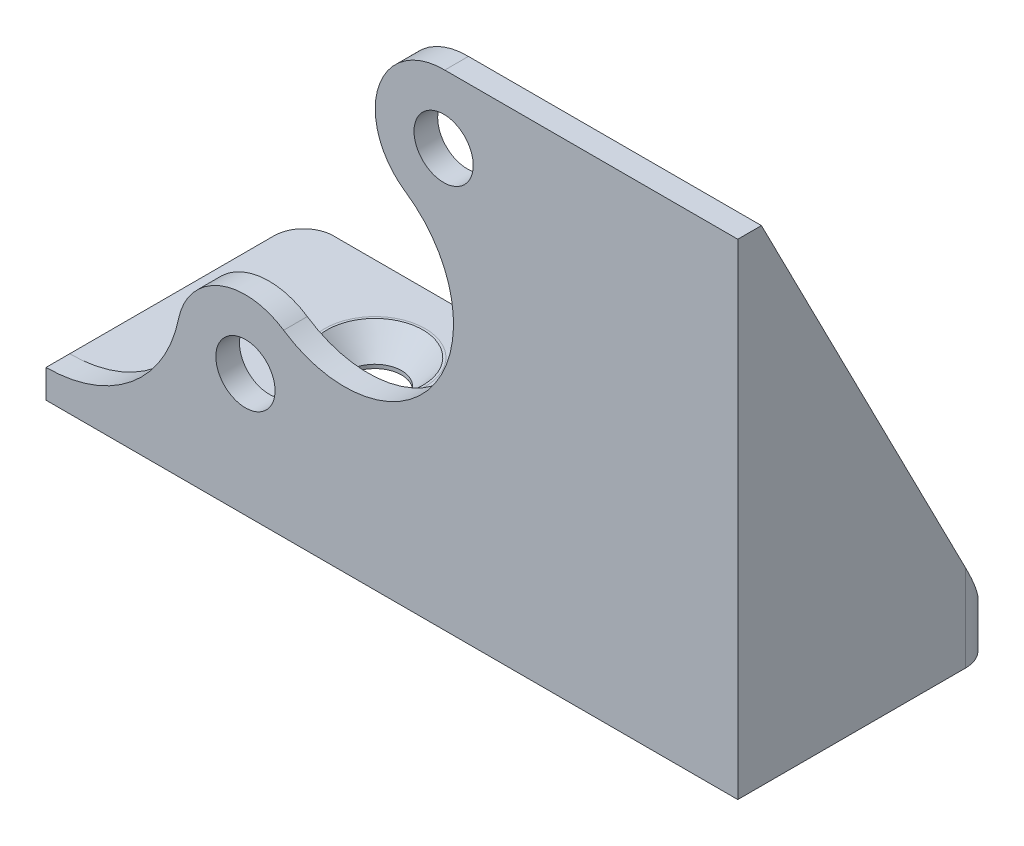
ISO-10303-21;
HEADER;
FILE_DESCRIPTION(('STEP AP214'),'2;1');
FILE_NAME('part.step','',(''),(''),'','','');
FILE_SCHEMA(('AUTOMOTIVE_DESIGN { 1 0 10303 214 1 1 1 1 }'));
ENDSEC;
DATA;
#1=APPLICATION_CONTEXT('core data for automotive mechanical design processes');
#2=APPLICATION_PROTOCOL_DEFINITION('international standard','automotive_design',2000,#1);
#3=PRODUCT_CONTEXT('',#1,'mechanical');
#4=PRODUCT('Part','Part','',(#3));
#5=PRODUCT_RELATED_PRODUCT_CATEGORY('part','',(#4));
#6=PRODUCT_DEFINITION_FORMATION('','',#4);
#7=PRODUCT_DEFINITION_CONTEXT('part definition',#1,'design');
#8=PRODUCT_DEFINITION('design','',#6,#7);
#9=PRODUCT_DEFINITION_SHAPE('','',#8);
#10=(LENGTH_UNIT() NAMED_UNIT(*) SI_UNIT(.MILLI.,.METRE.));
#11=(NAMED_UNIT(*) PLANE_ANGLE_UNIT() SI_UNIT($,.RADIAN.));
#12=(NAMED_UNIT(*) SI_UNIT($,.STERADIAN.) SOLID_ANGLE_UNIT());
#13=UNCERTAINTY_MEASURE_WITH_UNIT(LENGTH_MEASURE(1.E-05),#10,'distance_accuracy_value','');
#14=(GEOMETRIC_REPRESENTATION_CONTEXT(3) GLOBAL_UNCERTAINTY_ASSIGNED_CONTEXT((#13)) GLOBAL_UNIT_ASSIGNED_CONTEXT((#10,
#11,#12)) REPRESENTATION_CONTEXT('',''));
#15=CARTESIAN_POINT('',(0.,0.,0.));
#16=DIRECTION('',(0.,0.,1.));
#17=DIRECTION('',(1.,0.,0.));
#18=AXIS2_PLACEMENT_3D('',#15,#16,#17);
#19=CARTESIAN_POINT('',(85.20684,10.16,0.));
#20=DIRECTION('',(0.,0.,1.));
#21=DIRECTION('',(0.,-1.,0.));
#22=AXIS2_PLACEMENT_3D('',#19,#20,#21);
#23=CYLINDRICAL_SURFACE('',#22,6.35);
#24=CARTESIAN_POINT('',(85.20684,3.81,-17.7226847710446));
#25=CARTESIAN_POINT('',(85.354379722513,3.80998373406652,-17.8121221627858));
#26=CARTESIAN_POINT('',(85.498198826381,3.8151402255102,-17.9074838363655));
#27=CARTESIAN_POINT('',(85.7772022005539,3.83412826148672,-18.1089939360989));
#28=CARTESIAN_POINT('',(85.9123972850762,3.84794869637912,-18.21512840262));
#29=CARTESIAN_POINT('',(86.1726238699845,3.88250726730236,-18.4367445525352));
#30=CARTESIAN_POINT('',(86.297707202864,3.90320691962987,-18.5521715884824));
#31=CARTESIAN_POINT('',(86.5378782720371,3.94986186683063,-18.7919935550968));
#32=CARTESIAN_POINT('',(86.6529627990034,3.9758188403117,-18.9163913418415));
#33=CARTESIAN_POINT('',(86.9814337794092,4.0588438523635,-19.3007529360063));
#34=CARTESIAN_POINT('',(87.1794215779039,4.12128343337041,-19.5730704513461));
#35=CARTESIAN_POINT('',(87.4427374000977,4.21592543319725,-20.0017820946959));
#36=CARTESIAN_POINT('',(87.5249885153752,4.24768104527225,-20.1482747514422));
#37=CARTESIAN_POINT('',(87.6779262315634,4.30995394851132,-20.4475145014094));
#38=CARTESIAN_POINT('',(87.7486117411309,4.34047112261098,-20.6002621831629));
#39=CARTESIAN_POINT('',(87.8839943838683,4.40140917666914,-20.9257897625941));
#40=CARTESIAN_POINT('',(87.9475191764759,4.43155593230939,-21.0991097573252));
#41=CARTESIAN_POINT('',(88.059617716431,4.48654773426665,-21.4512718790294));
#42=CARTESIAN_POINT('',(88.1081981332002,4.51139514406898,-21.6301115033606));
#43=CARTESIAN_POINT('',(88.1898174987243,4.55406825279581,-21.9918554761606));
#44=CARTESIAN_POINT('',(88.2228798887303,4.57190453593454,-22.1747532538717));
#45=CARTESIAN_POINT('',(88.2730950235013,4.59929783272596,-22.5433279708794));
#46=CARTESIAN_POINT('',(88.2902501906425,4.60885610695186,-22.7290044826488));
#47=CARTESIAN_POINT('',(88.3075518030532,4.61850499387268,-23.0843542628922));
#48=CARTESIAN_POINT('',(88.3091096800331,4.61938118381739,-23.2539389021093));
#49=CARTESIAN_POINT('',(88.2988519097806,4.61365008727892,-23.5925680064854));
#50=CARTESIAN_POINT('',(88.2870369021661,4.60704315870927,-23.7616124970916));
#51=CARTESIAN_POINT('',(88.2501848431399,4.58676088340801,-24.0978899891909));
#52=CARTESIAN_POINT('',(88.2251425403864,4.5730827293893,-24.2651222442831));
#53=CARTESIAN_POINT('',(88.1621592443436,4.53951602063235,-24.5964636815241));
#54=CARTESIAN_POINT('',(88.1242179604866,4.51962732599381,-24.7605727932319));
#55=CARTESIAN_POINT('',(87.9958603807992,4.45448655398265,-25.2311211178603));
#56=CARTESIAN_POINT('',(87.8889952077121,4.40254770628755,-25.5322837829604));
#57=CARTESIAN_POINT('',(87.6326709862505,4.28996431406812,-26.1144370367338));
#58=CARTESIAN_POINT('',(87.4831593136597,4.22930905998869,-26.3954021627393));
#59=CARTESIAN_POINT('',(87.2177872075547,4.13596863207643,-26.8160491532045));
#60=CARTESIAN_POINT('',(87.1153979798537,4.10254727148534,-26.9642177261155));
#61=CARTESIAN_POINT('',(86.898206354131,4.03834993775841,-27.251888261672));
#62=CARTESIAN_POINT('',(86.7834009668502,4.0075746048839,-27.3913881244919));
#63=CARTESIAN_POINT('',(86.5422654225588,3.95077763399164,-27.6604019669838));
#64=CARTESIAN_POINT('',(86.4159670852707,3.92474343600862,-27.7899417896237));
#65=CARTESIAN_POINT('',(86.1523218270195,3.87936025336879,-28.0384012367875));
#66=CARTESIAN_POINT('',(86.0149826649179,3.86000662375526,-28.1573281975342));
#67=CARTESIAN_POINT('',(85.7668678227715,3.8338508775464,-28.3543840015657));
#68=CARTESIAN_POINT('',(85.6583674928954,3.82509948733602,-28.4351285890268));
#69=CARTESIAN_POINT('',(85.4362838435122,3.81317042384981,-28.5897708085495));
#70=CARTESIAN_POINT('',(85.3226998159572,3.80999352947218,-28.6636674824181));
#71=CARTESIAN_POINT('',(85.20684,3.81,-28.7339153649557));
#72=B_SPLINE_CURVE_WITH_KNOTS('',3,(#24,#25,#26,#27,#28,#29,#30,#31,#32,#33,#34,#35,#36,#37,#38,
#39,#40,#41,#42,#43,#44,#45,#46,#47,#48,#49,#50,#51,#52,#53,#54,#55,#56,#57,#58,#59,#60,#61,#62,
#63,#64,#65,#66,#67,#68,#69,#70,#71),.UNSPECIFIED.,.F.,.F.,(4,2,2,2,2,2,2,2,2,2,2,2,2,2,2,2,2,2,
2,2,2,2,2,4),(0.,0.517213777482924,1.03376569253408,1.54747523650469,2.06134906187964,
3.08365328336137,3.59622214200442,4.10883933934088,4.66923868044842,5.22938756078055,
5.7886875452052,6.34790234457907,6.8559989407938,7.36407123604878,7.87234539183976,
8.38063099797549,9.34784763169406,10.3162629771403,10.8652494101558,11.4143683101634,
11.9620106524703,12.5092714519166,12.915501123055,13.3217875502457),.UNSPECIFIED.);
#73=CARTESIAN_POINT('',(85.20684,3.81,-17.7226847710446));
#74=VERTEX_POINT('',#73);
#75=CARTESIAN_POINT('',(85.20684,3.81,-28.7339153649557));
#76=VERTEX_POINT('',#75);
#77=EDGE_CURVE('E245',#74,#76,#72,.T.);
#78=ORIENTED_EDGE('',*,*,#77,.F.);
#79=DIRECTION('',(0.,0.,1.));
#80=VECTOR('',#79,1.);
#81=CARTESIAN_POINT('',(85.20684,3.81,-3.175));
#82=LINE('',#81,#80);
#83=CARTESIAN_POINT('',(85.20684,3.81000000000001,-17.3691315025746));
#84=VERTEX_POINT('',#83);
#85=EDGE_CURVE('E254',#84,#74,#82,.F.);
#86=ORIENTED_EDGE('',*,*,#85,.F.);
#87=CARTESIAN_POINT('',(85.20684,3.81,-3.175));
#88=VERTEX_POINT('',#87);
#89=EDGE_CURVE('E265',#88,#84,#82,.F.);
#90=ORIENTED_EDGE('',*,*,#89,.F.);
#91=CARTESIAN_POINT('',(85.20684,10.16,-3.175));
#92=DIRECTION('',(0.,0.,1.));
#93=DIRECTION('',(1.,0.,0.));
#94=AXIS2_PLACEMENT_3D('',#91,#92,#93);
#95=CIRCLE('',#94,6.35);
#96=CARTESIAN_POINT('',(91.55684,10.16,-3.17499999999999));
#97=VERTEX_POINT('',#96);
#98=EDGE_CURVE('E275',#97,#88,#95,.F.);
#99=ORIENTED_EDGE('',*,*,#98,.F.);
#100=DIRECTION('',(0.,0.,1.));
#101=VECTOR('',#100,1.);
#102=CARTESIAN_POINT('',(91.55684,10.16,0.));
#103=LINE('',#102,#101);
#104=CARTESIAN_POINT('',(91.55684,10.16,-31.3423161271238));
#105=VERTEX_POINT('',#104);
#106=EDGE_CURVE('E280',#105,#97,#103,.T.);
#107=ORIENTED_EDGE('',*,*,#106,.F.);
#108=CARTESIAN_POINT('',(85.20684,10.16,-31.3423161271238));
#109=DIRECTION('',(0.,0.455880849534502,-0.890040814248257));
#110=DIRECTION('',(0.,0.890040814248257,0.455880849534502));
#111=AXIS2_PLACEMENT_3D('',#108,#109,#110);
#112=ELLIPSE('',#111,7.13450428154052,6.35);
#113=CARTESIAN_POINT('',(85.20684,3.81,-34.5948));
#114=VERTEX_POINT('',#113);
#115=EDGE_CURVE('E271',#114,#105,#112,.F.);
#116=ORIENTED_EDGE('',*,*,#115,.F.);
#117=CARTESIAN_POINT('',(85.20684,3.81000000000001,-29.0874686334257));
#118=VERTEX_POINT('',#117);
#119=EDGE_CURVE('E267',#118,#114,#82,.F.);
#120=ORIENTED_EDGE('',*,*,#119,.F.);
#121=EDGE_CURVE('E143',#76,#118,#82,.F.);
#122=ORIENTED_EDGE('',*,*,#121,.F.);
#123=EDGE_LOOP('',(#78,#86,#90,#99,#107,#116,#120,#122));
#124=FACE_BOUND('',#123,.T.);
#125=ADVANCED_FACE('F128',(#124),#23,.F.);
#126=CARTESIAN_POINT('',(130.055584981414,3.81,-3.175));
#127=DIRECTION('',(0.,-1.,0.));
#128=DIRECTION('',(0.,0.,1.));
#129=AXIS2_PLACEMENT_3D('',#126,#127,#128);
#130=PLANE('',#129);
#131=CARTESIAN_POINT('',(25.9680328160001,3.81000000000001,-23.2283000680002));
#132=DIRECTION('',(0.,-1.,0.));
#133=DIRECTION('',(0.,0.,-1.));
#134=AXIS2_PLACEMENT_3D('',#131,#132,#133);
#135=CIRCLE('',#134,6.7437);
#136=CARTESIAN_POINT('',(25.9680328160001,3.81000000000001,-29.9720000680002));
#137=VERTEX_POINT('',#136);
#138=EDGE_CURVE('E137',#137,#137,#135,.F.);
#139=ORIENTED_EDGE('',*,*,#138,.F.);
#140=EDGE_LOOP('',(#139));
#141=FACE_BOUND('',#140,.T.);
#142=CARTESIAN_POINT('',(81.8680328160001,3.81000000000001,-23.2283000680001));
#143=DIRECTION('',(0.,-1.,0.));
#144=DIRECTION('',(0.,0.,-1.));
#145=AXIS2_PLACEMENT_3D('',#142,#143,#144);
#146=CIRCLE('',#145,6.74370000000001);
#147=EDGE_CURVE('E12',#118,#84,#146,.F.);
#148=ORIENTED_EDGE('',*,*,#147,.F.);
#149=ORIENTED_EDGE('',*,*,#119,.T.);
#150=DIRECTION('',(-1.,0.,0.));
#151=VECTOR('',#150,1.);
#152=CARTESIAN_POINT('',(130.055584981414,3.81,-34.5948));
#153=LINE('',#152,#151);
#154=CARTESIAN_POINT('',(9.03477999999999,3.81,-34.5948));
#155=VERTEX_POINT('',#154);
#156=EDGE_CURVE('E383',#114,#155,#153,.T.);
#157=ORIENTED_EDGE('',*,*,#156,.T.);
#158=CARTESIAN_POINT('',(9.03478,3.81,-30.5943));
#159=DIRECTION('',(0.,1.,0.));
#160=DIRECTION('',(0.,0.,1.));
#161=AXIS2_PLACEMENT_3D('',#158,#159,#160);
#162=CIRCLE('',#161,4.0005);
#163=CARTESIAN_POINT('',(5.03428,3.81,-30.5943));
#164=VERTEX_POINT('',#163);
#165=EDGE_CURVE('E332',#164,#155,#162,.F.);
#166=ORIENTED_EDGE('',*,*,#165,.F.);
#167=DIRECTION('',(0.,0.,-1.));
#168=VECTOR('',#167,1.);
#169=CARTESIAN_POINT('',(5.03428,3.81,-3.175));
#170=LINE('',#169,#168);
#171=CARTESIAN_POINT('',(5.03428,3.81,-3.175));
#172=VERTEX_POINT('',#171);
#173=EDGE_CURVE('E384',#172,#164,#170,.T.);
#174=ORIENTED_EDGE('',*,*,#173,.F.);
#175=DIRECTION('',(-1.,0.,0.));
#176=VECTOR('',#175,1.);
#177=CARTESIAN_POINT('',(130.055584981414,3.81,-3.175));
#178=LINE('',#177,#176);
#179=EDGE_CURVE('E374',#88,#172,#178,.T.);
#180=ORIENTED_EDGE('',*,*,#179,.F.);
#181=ORIENTED_EDGE('',*,*,#89,.T.);
#182=EDGE_LOOP('',(#148,#149,#157,#166,#174,#180,#181));
#183=FACE_BOUND('',#182,.T.);
#184=ADVANCED_FACE('F502',(#141,#183),#130,.F.);
#185=ORIENTED_EDGE('',*,*,#85,.T.);
#186=CARTESIAN_POINT('',(81.8680328160001,3.81,-23.2283000680001));
#187=DIRECTION('',(0.,1.,0.));
#188=DIRECTION('',(0.,0.,1.));
#189=AXIS2_PLACEMENT_3D('',#186,#187,#188);
#190=CIRCLE('',#189,6.4389);
#191=EDGE_CURVE('E250',#76,#74,#190,.T.);
#192=ORIENTED_EDGE('',*,*,#191,.F.);
#193=ORIENTED_EDGE('',*,*,#121,.T.);
#194=ORIENTED_EDGE('',*,*,#147,.T.);
#195=EDGE_LOOP('',(#185,#192,#193,#194));
#196=FACE_BOUND('',#195,.T.);
#197=ADVANCED_FACE('F263',(#196),#130,.F.);
#198=CARTESIAN_POINT('',(97.90684,0.,3.175));
#199=DIRECTION('',(-1.,0.,0.));
#200=DIRECTION('',(0.,0.,1.));
#201=AXIS2_PLACEMENT_3D('',#198,#199,#200);
#202=PLANE('',#201);
#203=DIRECTION('',(0.,0.,-1.));
#204=VECTOR('',#203,1.);
#205=CARTESIAN_POINT('',(97.90684,65.1525731834804,3.175));
#206=LINE('',#205,#204);
#207=CARTESIAN_POINT('',(97.90684,65.1525731834804,0.));
#208=VERTEX_POINT('',#207);
#209=CARTESIAN_POINT('',(97.90684,65.1525731834804,-3.175));
#210=VERTEX_POINT('',#209);
#211=EDGE_CURVE('E300',#208,#210,#206,.T.);
#212=ORIENTED_EDGE('',*,*,#211,.F.);
#213=DIRECTION('',(0.,-1.,0.));
#214=VECTOR('',#213,1.);
#215=CARTESIAN_POINT('',(97.90684,0.,0.));
#216=LINE('',#215,#214);
#217=CARTESIAN_POINT('',(97.90684,0.,0.));
#218=VERTEX_POINT('',#217);
#219=EDGE_CURVE('E413',#208,#218,#216,.T.);
#220=ORIENTED_EDGE('',*,*,#219,.T.);
#221=DIRECTION('',(0.,0.,-1.));
#222=VECTOR('',#221,1.);
#223=CARTESIAN_POINT('',(97.90684,0.,-3.175));
#224=LINE('',#223,#222);
#225=CARTESIAN_POINT('',(97.90684,0.,-30.5943));
#226=VERTEX_POINT('',#225);
#227=EDGE_CURVE('E317',#218,#226,#224,.T.);
#228=ORIENTED_EDGE('',*,*,#227,.T.);
#229=DIRECTION('',(0.,1.,0.));
#230=VECTOR('',#229,1.);
#231=CARTESIAN_POINT('',(97.90684,0.,-30.5943));
#232=LINE('',#231,#230);
#233=CARTESIAN_POINT('',(97.90684,11.6203923010494,-30.5943));
#234=VERTEX_POINT('',#233);
#235=EDGE_CURVE('E325',#234,#226,#232,.F.);
#236=ORIENTED_EDGE('',*,*,#235,.F.);
#237=DIRECTION('',(0.,-0.890040814248257,-0.455880849534502));
#238=VECTOR('',#237,1.);
#239=CARTESIAN_POINT('',(97.90684,3.81,-34.5948));
#240=LINE('',#239,#238);
#241=EDGE_CURVE('E389',#210,#234,#240,.T.);
#242=ORIENTED_EDGE('',*,*,#241,.F.);
#243=EDGE_LOOP('',(#212,#220,#228,#236,#242));
#244=FACE_BOUND('',#243,.T.);
#245=ADVANCED_FACE('F538',(#244),#202,.F.);
#246=CARTESIAN_POINT('',(0.,0.,3.175));
#247=DIRECTION('',(0.,1.,0.));
#248=DIRECTION('',(0.,0.,1.));
#249=AXIS2_PLACEMENT_3D('',#246,#247,#248);
#250=PLANE('',#249);
#251=CARTESIAN_POINT('',(25.9680328160001,0.,-23.2283000680002));
#252=DIRECTION('',(0.,1.,0.));
#253=DIRECTION('',(0.,0.,1.));
#254=AXIS2_PLACEMENT_3D('',#251,#252,#253);
#255=CIRCLE('',#254,3.57124);
#256=CARTESIAN_POINT('',(25.9680328160001,0.,-19.6570600680002));
#257=VERTEX_POINT('',#256);
#258=EDGE_CURVE('E262',#257,#257,#255,.T.);
#259=ORIENTED_EDGE('',*,*,#258,.T.);
#260=EDGE_LOOP('',(#259));
#261=FACE_BOUND('',#260,.T.);
#262=CARTESIAN_POINT('',(81.8680328160001,0.,-23.2283000680001));
#263=DIRECTION('',(0.,1.,0.));
#264=DIRECTION('',(0.,0.,1.));
#265=AXIS2_PLACEMENT_3D('',#262,#263,#264);
#266=CIRCLE('',#265,3.57124);
#267=CARTESIAN_POINT('',(81.8680328160001,0.,-19.6570600680001));
#268=VERTEX_POINT('',#267);
#269=EDGE_CURVE('E439',#268,#268,#266,.T.);
#270=ORIENTED_EDGE('',*,*,#269,.T.);
#271=EDGE_LOOP('',(#270));
#272=FACE_BOUND('',#271,.T.);
#273=DIRECTION('',(-1.,0.,0.));
#274=VECTOR('',#273,1.);
#275=CARTESIAN_POINT('',(0.,0.,0.));
#276=LINE('',#275,#274);
#277=CARTESIAN_POINT('',(5.03428,0.,0.));
#278=VERTEX_POINT('',#277);
#279=EDGE_CURVE('E417',#218,#278,#276,.T.);
#280=ORIENTED_EDGE('',*,*,#279,.T.);
#281=DIRECTION('',(0.,0.,1.));
#282=VECTOR('',#281,1.);
#283=CARTESIAN_POINT('',(5.03428,0.,-3.175));
#284=LINE('',#283,#282);
#285=CARTESIAN_POINT('',(5.03428,0.,-30.5943));
#286=VERTEX_POINT('',#285);
#287=EDGE_CURVE('E301',#286,#278,#284,.T.);
#288=ORIENTED_EDGE('',*,*,#287,.F.);
#289=CARTESIAN_POINT('',(9.03478000000001,0.,-30.5943));
#290=DIRECTION('',(0.,1.,0.));
#291=DIRECTION('',(0.,0.,1.));
#292=AXIS2_PLACEMENT_3D('',#289,#290,#291);
#293=CIRCLE('',#292,4.0005);
#294=CARTESIAN_POINT('',(9.03478000000001,0.,-34.5948));
#295=VERTEX_POINT('',#294);
#296=EDGE_CURVE('E295',#286,#295,#293,.F.);
#297=ORIENTED_EDGE('',*,*,#296,.T.);
#298=DIRECTION('',(1.,0.,0.));
#299=VECTOR('',#298,1.);
#300=CARTESIAN_POINT('',(9.03478000000001,0.,-34.5948));
#301=LINE('',#300,#299);
#302=CARTESIAN_POINT('',(93.90634,0.,-34.5948));
#303=VERTEX_POINT('',#302);
#304=EDGE_CURVE('E434',#295,#303,#301,.T.);
#305=ORIENTED_EDGE('',*,*,#304,.T.);
#306=CARTESIAN_POINT('',(93.90634,0.,-30.5943));
#307=DIRECTION('',(0.,1.,0.));
#308=DIRECTION('',(0.,0.,1.));
#309=AXIS2_PLACEMENT_3D('',#306,#307,#308);
#310=CIRCLE('',#309,4.0005);
#311=EDGE_CURVE('E431',#303,#226,#310,.F.);
#312=ORIENTED_EDGE('',*,*,#311,.T.);
#313=ORIENTED_EDGE('',*,*,#227,.F.);
#314=EDGE_LOOP('',(#280,#288,#297,#305,#312,#313));
#315=FACE_BOUND('',#314,.T.);
#316=ADVANCED_FACE('F541',(#261,#272,#315),#250,.F.);
#317=CARTESIAN_POINT('',(5.03427999999997,21.9626785235299,3.175));
#318=DIRECTION('',(0.,0.,-1.));
#319=DIRECTION('',(-1.,0.,0.));
#320=AXIS2_PLACEMENT_3D('',#317,#318,#319);
#321=CYLINDRICAL_SURFACE('',#320,18.1526785235299);
#322=CARTESIAN_POINT('',(5.03427999999997,21.9626785235299,0.));
#323=DIRECTION('',(0.,0.,-1.));
#324=DIRECTION('',(-1.,0.,0.));
#325=AXIS2_PLACEMENT_3D('',#322,#323,#324);
#326=CIRCLE('',#325,18.1526785235299);
#327=CARTESIAN_POINT('',(22.8171620588056,18.3172919512674,0.));
#328=VERTEX_POINT('',#327);
#329=CARTESIAN_POINT('',(5.03428,3.81000000000001,0.));
#330=VERTEX_POINT('',#329);
#331=EDGE_CURVE('E421',#328,#330,#326,.T.);
#332=ORIENTED_EDGE('',*,*,#331,.F.);
#333=DIRECTION('',(0.,0.,-1.));
#334=VECTOR('',#333,1.);
#335=CARTESIAN_POINT('',(22.8171620588057,18.3172919512674,3.175));
#336=LINE('',#335,#334);
#337=CARTESIAN_POINT('',(22.8171620588057,18.3172919512674,-3.175));
#338=VERTEX_POINT('',#337);
#339=EDGE_CURVE('E287',#328,#338,#336,.T.);
#340=ORIENTED_EDGE('',*,*,#339,.T.);
#341=CARTESIAN_POINT('',(5.03427999999997,21.9626785235299,-3.175));
#342=DIRECTION('',(0.,0.,-1.));
#343=DIRECTION('',(-1.,0.,0.));
#344=AXIS2_PLACEMENT_3D('',#341,#342,#343);
#345=CIRCLE('',#344,18.1526785235299);
#346=EDGE_CURVE('E365',#172,#338,#345,.F.);
#347=ORIENTED_EDGE('',*,*,#346,.F.);
#348=DIRECTION('',(0.,0.,-1.));
#349=VECTOR('',#348,1.);
#350=CARTESIAN_POINT('',(5.03428,3.81000000000001,3.175));
#351=LINE('',#350,#349);
#352=EDGE_CURVE('E296',#330,#172,#351,.T.);
#353=ORIENTED_EDGE('',*,*,#352,.F.);
#354=EDGE_LOOP('',(#332,#340,#347,#353));
#355=FACE_BOUND('',#354,.T.);
#356=ADVANCED_FACE('F525',(#355),#321,.F.);
#357=CARTESIAN_POINT('',(31.8101655818956,16.4737789493269,3.175));
#358=DIRECTION('',(0.,0.,-1.));
#359=DIRECTION('',(-1.,0.,0.));
#360=AXIS2_PLACEMENT_3D('',#357,#358,#359);
#361=CYLINDRICAL_SURFACE('',#360,9.18001375568854);
#362=CARTESIAN_POINT('',(31.8101655818956,16.4737789493269,0.));
#363=DIRECTION('',(0.,0.,-1.));
#364=DIRECTION('',(-1.,0.,0.));
#365=AXIS2_PLACEMENT_3D('',#362,#363,#364);
#366=CIRCLE('',#365,9.18001375568854);
#367=CARTESIAN_POINT('',(36.9386526799485,24.087665777993,0.));
#368=VERTEX_POINT('',#367);
#369=EDGE_CURVE('E394',#368,#328,#366,.F.);
#370=ORIENTED_EDGE('',*,*,#369,.F.);
#371=DIRECTION('',(0.,0.,-1.));
#372=VECTOR('',#371,1.);
#373=CARTESIAN_POINT('',(36.9386526799485,24.087665777993,3.175));
#374=LINE('',#373,#372);
#375=CARTESIAN_POINT('',(36.9386526799485,24.087665777993,-3.175));
#376=VERTEX_POINT('',#375);
#377=EDGE_CURVE('E310',#368,#376,#374,.T.);
#378=ORIENTED_EDGE('',*,*,#377,.T.);
#379=CARTESIAN_POINT('',(31.8101655818956,16.4737789493269,-3.175));
#380=DIRECTION('',(0.,0.,-1.));
#381=DIRECTION('',(-1.,0.,0.));
#382=AXIS2_PLACEMENT_3D('',#379,#380,#381);
#383=CIRCLE('',#382,9.18001375568854);
#384=EDGE_CURVE('E348',#338,#376,#383,.T.);
#385=ORIENTED_EDGE('',*,*,#384,.F.);
#386=ORIENTED_EDGE('',*,*,#339,.F.);
#387=EDGE_LOOP('',(#370,#378,#385,#386));
#388=FACE_BOUND('',#387,.T.);
#389=ADVANCED_FACE('F521',(#388),#361,.T.);
#390=CARTESIAN_POINT('',(45.1132065437581,36.2238234408466,3.175));
#391=DIRECTION('',(0.,0.,-1.));
#392=DIRECTION('',(-1.,0.,0.));
#393=AXIS2_PLACEMENT_3D('',#390,#391,#392);
#394=CYLINDRICAL_SURFACE('',#393,14.6324862443115);
#395=ORIENTED_EDGE('',*,*,#377,.F.);
#396=CARTESIAN_POINT('',(45.1132065437581,36.2238234408466,0.));
#397=DIRECTION('',(0.,0.,-1.));
#398=DIRECTION('',(-1.,0.,0.));
#399=AXIS2_PLACEMENT_3D('',#396,#397,#398);
#400=CIRCLE('',#399,14.6324862443115);
#401=CARTESIAN_POINT('',(53.287760407567,48.3599811037007,0.));
#402=VERTEX_POINT('',#401);
#403=EDGE_CURVE('E402',#368,#402,#400,.F.);
#404=ORIENTED_EDGE('',*,*,#403,.T.);
#405=DIRECTION('',(0.,0.,-1.));
#406=VECTOR('',#405,1.);
#407=CARTESIAN_POINT('',(53.287760407567,48.3599811037007,3.175));
#408=LINE('',#407,#406);
#409=CARTESIAN_POINT('',(53.287760407567,48.3599811037007,-3.175));
#410=VERTEX_POINT('',#409);
#411=EDGE_CURVE('E307',#402,#410,#408,.T.);
#412=ORIENTED_EDGE('',*,*,#411,.T.);
#413=CARTESIAN_POINT('',(45.1132065437581,36.2238234408466,-3.175));
#414=DIRECTION('',(0.,0.,-1.));
#415=DIRECTION('',(-1.,0.,0.));
#416=AXIS2_PLACEMENT_3D('',#413,#414,#415);
#417=CIRCLE('',#416,14.6324862443115);
#418=EDGE_CURVE('E352',#410,#376,#417,.T.);
#419=ORIENTED_EDGE('',*,*,#418,.T.);
#420=EDGE_LOOP('',(#395,#404,#412,#419));
#421=FACE_BOUND('',#420,.T.);
#422=ADVANCED_FACE('F524',(#421),#394,.F.);
#423=CARTESIAN_POINT('',(58.4162475056198,55.9738679323675,3.175));
#424=DIRECTION('',(0.,0.,-1.));
#425=DIRECTION('',(-1.,0.,0.));
#426=AXIS2_PLACEMENT_3D('',#423,#424,#425);
#427=CYLINDRICAL_SURFACE('',#426,9.18001375568909);
#428=CARTESIAN_POINT('',(58.4162475056198,55.9738679323675,0.));
#429=DIRECTION('',(0.,0.,-1.));
#430=DIRECTION('',(-1.,0.,0.));
#431=AXIS2_PLACEMENT_3D('',#428,#429,#430);
#432=CIRCLE('',#431,9.18001375568909);
#433=CARTESIAN_POINT('',(58.5712393371263,65.1525731834804,0.));
#434=VERTEX_POINT('',#433);
#435=EDGE_CURVE('E406',#434,#402,#432,.F.);
#436=ORIENTED_EDGE('',*,*,#435,.F.);
#437=DIRECTION('',(0.,0.,-1.));
#438=VECTOR('',#437,1.);
#439=CARTESIAN_POINT('',(58.5712393371263,65.1525731834804,3.175));
#440=LINE('',#439,#438);
#441=CARTESIAN_POINT('',(58.5712393371263,65.1525731834804,-3.175));
#442=VERTEX_POINT('',#441);
#443=EDGE_CURVE('E304',#434,#442,#440,.T.);
#444=ORIENTED_EDGE('',*,*,#443,.T.);
#445=CARTESIAN_POINT('',(58.4162475056198,55.9738679323675,-3.175));
#446=DIRECTION('',(0.,0.,-1.));
#447=DIRECTION('',(-1.,0.,0.));
#448=AXIS2_PLACEMENT_3D('',#445,#446,#447);
#449=CIRCLE('',#448,9.18001375568909);
#450=EDGE_CURVE('E356',#410,#442,#449,.T.);
#451=ORIENTED_EDGE('',*,*,#450,.F.);
#452=ORIENTED_EDGE('',*,*,#411,.F.);
#453=EDGE_LOOP('',(#436,#444,#451,#452));
#454=FACE_BOUND('',#453,.T.);
#455=ADVANCED_FACE('F529',(#454),#427,.T.);
#456=CARTESIAN_POINT('',(0.,65.1525731834804,3.175));
#457=DIRECTION('',(0.,-1.,0.));
#458=DIRECTION('',(0.,0.,-1.));
#459=AXIS2_PLACEMENT_3D('',#456,#457,#458);
#460=PLANE('',#459);
#461=ORIENTED_EDGE('',*,*,#443,.F.);
#462=DIRECTION('',(1.,0.,0.));
#463=VECTOR('',#462,1.);
#464=CARTESIAN_POINT('',(0.,65.1525731834804,0.));
#465=LINE('',#464,#463);
#466=EDGE_CURVE('E409',#434,#208,#465,.T.);
#467=ORIENTED_EDGE('',*,*,#466,.T.);
#468=ORIENTED_EDGE('',*,*,#211,.T.);
#469=DIRECTION('',(-1.,0.,0.));
#470=VECTOR('',#469,1.);
#471=CARTESIAN_POINT('',(0.,65.1525731834804,-3.175));
#472=LINE('',#471,#470);
#473=CARTESIAN_POINT('',(91.55684,65.1525731834804,-3.175));
#474=VERTEX_POINT('',#473);
#475=EDGE_CURVE('E360',#210,#474,#472,.T.);
#476=ORIENTED_EDGE('',*,*,#475,.T.);
#477=EDGE_CURVE('E364',#474,#442,#472,.T.);
#478=ORIENTED_EDGE('',*,*,#477,.T.);
#479=EDGE_LOOP('',(#461,#467,#468,#476,#478));
#480=FACE_BOUND('',#479,.T.);
#481=ADVANCED_FACE('F533',(#480),#460,.F.);
#482=CARTESIAN_POINT('',(5.03428,0.,3.175));
#483=DIRECTION('',(-1.,0.,0.));
#484=DIRECTION('',(0.,-1.,0.));
#485=AXIS2_PLACEMENT_3D('',#482,#483,#484);
#486=PLANE('',#485);
#487=DIRECTION('',(0.,-1.,0.));
#488=VECTOR('',#487,1.);
#489=CARTESIAN_POINT('',(5.03428,0.,0.));
#490=LINE('',#489,#488);
#491=EDGE_CURVE('E424',#330,#278,#490,.T.);
#492=ORIENTED_EDGE('',*,*,#491,.F.);
#493=ORIENTED_EDGE('',*,*,#352,.T.);
#494=ORIENTED_EDGE('',*,*,#173,.T.);
#495=DIRECTION('',(0.,-1.,0.));
#496=VECTOR('',#495,1.);
#497=CARTESIAN_POINT('',(5.03428,3.81,-30.5943));
#498=LINE('',#497,#496);
#499=EDGE_CURVE('E344',#286,#164,#498,.F.);
#500=ORIENTED_EDGE('',*,*,#499,.F.);
#501=ORIENTED_EDGE('',*,*,#287,.T.);
#502=EDGE_LOOP('',(#492,#493,#494,#500,#501));
#503=FACE_BOUND('',#502,.T.);
#504=ADVANCED_FACE('F516',(#503),#486,.T.);
#505=CARTESIAN_POINT('',(58.4162475056198,55.9738679323675,3.175));
#506=DIRECTION('',(0.,0.,-1.));
#507=DIRECTION('',(-1.,0.,0.));
#508=AXIS2_PLACEMENT_3D('',#505,#506,#507);
#509=CYLINDRICAL_SURFACE('',#508,3.97509999999996);
#510=CARTESIAN_POINT('',(58.4162475056198,55.9738679323675,0.));
#511=DIRECTION('',(0.,0.,-1.));
#512=DIRECTION('',(-1.,0.,0.));
#513=AXIS2_PLACEMENT_3D('',#510,#511,#512);
#514=CIRCLE('',#513,3.97509999999996);
#515=CARTESIAN_POINT('',(54.4411475056198,55.9738679323675,0.));
#516=VERTEX_POINT('',#515);
#517=EDGE_CURVE('E294',#516,#516,#514,.F.);
#518=ORIENTED_EDGE('',*,*,#517,.T.);
#519=EDGE_LOOP('',(#518));
#520=FACE_BOUND('',#519,.T.);
#521=CARTESIAN_POINT('',(58.4162475056198,55.9738679323675,-3.175));
#522=DIRECTION('',(0.,0.,-1.));
#523=DIRECTION('',(-1.,0.,0.));
#524=AXIS2_PLACEMENT_3D('',#521,#522,#523);
#525=CIRCLE('',#524,3.97509999999996);
#526=CARTESIAN_POINT('',(54.4411475056198,55.9738679323675,-3.175));
#527=VERTEX_POINT('',#526);
#528=EDGE_CURVE('E369',#527,#527,#525,.T.);
#529=ORIENTED_EDGE('',*,*,#528,.T.);
#530=EDGE_LOOP('',(#529));
#531=FACE_BOUND('',#530,.T.);
#532=ADVANCED_FACE('F512',(#520,#531),#509,.F.);
#533=CARTESIAN_POINT('',(31.8101655818956,16.4737789493269,3.175));
#534=DIRECTION('',(0.,0.,-1.));
#535=DIRECTION('',(-1.,0.,0.));
#536=AXIS2_PLACEMENT_3D('',#533,#534,#535);
#537=CYLINDRICAL_SURFACE('',#536,3.9751);
#538=CARTESIAN_POINT('',(31.8101655818956,16.4737789493269,0.));
#539=DIRECTION('',(0.,0.,-1.));
#540=DIRECTION('',(-1.,0.,0.));
#541=AXIS2_PLACEMENT_3D('',#538,#539,#540);
#542=CIRCLE('',#541,3.9751);
#543=CARTESIAN_POINT('',(27.8350655818956,16.4737789493269,0.));
#544=VERTEX_POINT('',#543);
#545=EDGE_CURVE('E290',#544,#544,#542,.F.);
#546=ORIENTED_EDGE('',*,*,#545,.T.);
#547=EDGE_LOOP('',(#546));
#548=FACE_BOUND('',#547,.T.);
#549=CARTESIAN_POINT('',(31.8101655818956,16.4737789493269,-3.175));
#550=DIRECTION('',(0.,0.,-1.));
#551=DIRECTION('',(-1.,0.,0.));
#552=AXIS2_PLACEMENT_3D('',#549,#550,#551);
#553=CIRCLE('',#552,3.9751);
#554=CARTESIAN_POINT('',(27.8350655818956,16.4737789493269,-3.175));
#555=VERTEX_POINT('',#554);
#556=EDGE_CURVE('E370',#555,#555,#553,.T.);
#557=ORIENTED_EDGE('',*,*,#556,.T.);
#558=EDGE_LOOP('',(#557));
#559=FACE_BOUND('',#558,.T.);
#560=ADVANCED_FACE('F515',(#548,#559),#537,.F.);
#561=CARTESIAN_POINT('',(130.055584981414,-2.9972,-34.5948));
#562=DIRECTION('',(0.,0.,1.));
#563=DIRECTION('',(-1.,0.,0.));
#564=AXIS2_PLACEMENT_3D('',#561,#562,#563);
#565=PLANE('',#564);
#566=DIRECTION('',(0.,1.,0.));
#567=VECTOR('',#566,1.);
#568=CARTESIAN_POINT('',(93.90634,-2.9972,-34.5948));
#569=LINE('',#568,#567);
#570=CARTESIAN_POINT('',(93.90634,0.00279999999999942,-34.5948));
#571=VERTEX_POINT('',#570);
#572=EDGE_CURVE('E340',#303,#571,#569,.T.);
#573=ORIENTED_EDGE('',*,*,#572,.F.);
#574=ORIENTED_EDGE('',*,*,#304,.F.);
#575=DIRECTION('',(0.,-1.,0.));
#576=VECTOR('',#575,1.);
#577=CARTESIAN_POINT('',(9.03478000000001,-2.9972,-34.5948));
#578=LINE('',#577,#576);
#579=CARTESIAN_POINT('',(9.03478,0.00279999999999942,-34.5948));
#580=VERTEX_POINT('',#579);
#581=EDGE_CURVE('E339',#580,#295,#578,.T.);
#582=ORIENTED_EDGE('',*,*,#581,.F.);
#583=DIRECTION('',(1.,0.,0.));
#584=VECTOR('',#583,1.);
#585=CARTESIAN_POINT('',(130.055584981414,0.00279999999999942,-34.5948));
#586=LINE('',#585,#584);
#587=EDGE_CURVE('E321',#580,#571,#586,.T.);
#588=ORIENTED_EDGE('',*,*,#587,.T.);
#589=EDGE_LOOP('',(#573,#574,#582,#588));
#590=FACE_BOUND('',#589,.T.);
#591=ADVANCED_FACE('F498',(#590),#565,.F.);
#592=CARTESIAN_POINT('',(0.,0.,-3.175));
#593=DIRECTION('',(0.,0.,1.));
#594=DIRECTION('',(-1.,0.,0.));
#595=AXIS2_PLACEMENT_3D('',#592,#593,#594);
#596=PLANE('',#595);
#597=ORIENTED_EDGE('',*,*,#528,.F.);
#598=EDGE_LOOP('',(#597));
#599=FACE_BOUND('',#598,.T.);
#600=ORIENTED_EDGE('',*,*,#556,.F.);
#601=EDGE_LOOP('',(#600));
#602=FACE_BOUND('',#601,.T.);
#603=DIRECTION('',(0.,1.,0.));
#604=VECTOR('',#603,1.);
#605=CARTESIAN_POINT('',(91.55684,65.1525731834804,-3.175));
#606=LINE('',#605,#604);
#607=EDGE_CURVE('E388',#97,#474,#606,.T.);
#608=ORIENTED_EDGE('',*,*,#607,.F.);
#609=ORIENTED_EDGE('',*,*,#98,.T.);
#610=ORIENTED_EDGE('',*,*,#179,.T.);
#611=ORIENTED_EDGE('',*,*,#346,.T.);
#612=ORIENTED_EDGE('',*,*,#384,.T.);
#613=ORIENTED_EDGE('',*,*,#418,.F.);
#614=ORIENTED_EDGE('',*,*,#450,.T.);
#615=ORIENTED_EDGE('',*,*,#477,.F.);
#616=EDGE_LOOP('',(#608,#609,#610,#611,#612,#613,#614,#615));
#617=FACE_BOUND('',#616,.T.);
#618=ADVANCED_FACE('F496',(#599,#602,#617),#596,.F.);
#619=EDGE_CURVE('E336',#155,#580,#578,.T.);
#620=ORIENTED_EDGE('',*,*,#619,.F.);
#621=ORIENTED_EDGE('',*,*,#156,.F.);
#622=CARTESIAN_POINT('',(93.90634,3.81,-34.5948));
#623=VERTEX_POINT('',#622);
#624=EDGE_CURVE('E380',#623,#114,#153,.T.);
#625=ORIENTED_EDGE('',*,*,#624,.F.);
#626=EDGE_CURVE('E343',#571,#623,#569,.T.);
#627=ORIENTED_EDGE('',*,*,#626,.F.);
#628=ORIENTED_EDGE('',*,*,#587,.F.);
#629=EDGE_LOOP('',(#620,#621,#625,#627,#628));
#630=FACE_BOUND('',#629,.T.);
#631=ADVANCED_FACE('F493',(#630),#565,.F.);
#632=CARTESIAN_POINT('',(25.9680328160001,3.81,-23.2283000680002));
#633=DIRECTION('',(0.,1.,0.));
#634=DIRECTION('',(0.,0.,1.));
#635=AXIS2_PLACEMENT_3D('',#632,#633,#634);
#636=CIRCLE('',#635,6.4389);
#637=CARTESIAN_POINT('',(25.9680328160001,3.81,-16.7894000680002));
#638=VERTEX_POINT('',#637);
#639=EDGE_CURVE('E258',#638,#638,#636,.T.);
#640=ORIENTED_EDGE('',*,*,#639,.F.);
#641=EDGE_LOOP('',(#640));
#642=FACE_BOUND('',#641,.T.);
#643=ORIENTED_EDGE('',*,*,#138,.T.);
#644=EDGE_LOOP('',(#643));
#645=FACE_BOUND('',#644,.T.);
#646=ADVANCED_FACE('F491',(#642,#645),#130,.F.);
#647=CARTESIAN_POINT('',(91.55684,3.81,-34.5948));
#648=DIRECTION('',(0.,0.455880849534502,-0.890040814248257));
#649=DIRECTION('',(0.,-0.890040814248257,-0.455880849534502));
#650=AXIS2_PLACEMENT_3D('',#647,#648,#649);
#651=PLANE('',#650);
#652=ORIENTED_EDGE('',*,*,#624,.T.);
#653=ORIENTED_EDGE('',*,*,#115,.T.);
#654=DIRECTION('',(0.,-0.890040814248257,-0.455880849534502));
#655=VECTOR('',#654,1.);
#656=CARTESIAN_POINT('',(91.55684,3.81,-34.5948));
#657=LINE('',#656,#655);
#658=EDGE_CURVE('E393',#474,#105,#657,.T.);
#659=ORIENTED_EDGE('',*,*,#658,.F.);
#660=ORIENTED_EDGE('',*,*,#475,.F.);
#661=ORIENTED_EDGE('',*,*,#241,.T.);
#662=CARTESIAN_POINT('',(93.90634,11.6203923010494,-30.5943));
#663=DIRECTION('',(0.,-0.455880849534502,0.890040814248257));
#664=DIRECTION('',(0.,0.890040814248257,0.455880849534502));
#665=AXIS2_PLACEMENT_3D('',#662,#663,#664);
#666=ELLIPSE('',#665,8.77531926178714,4.0005);
#667=EDGE_CURVE('E329',#623,#234,#666,.T.);
#668=ORIENTED_EDGE('',*,*,#667,.F.);
#669=EDGE_LOOP('',(#652,#653,#659,#660,#661,#668));
#670=FACE_BOUND('',#669,.T.);
#671=ADVANCED_FACE('F487',(#670),#651,.T.);
#672=CARTESIAN_POINT('',(91.55684,0.,0.));
#673=DIRECTION('',(-1.,0.,0.));
#674=DIRECTION('',(0.,0.,-1.));
#675=AXIS2_PLACEMENT_3D('',#672,#673,#674);
#676=PLANE('',#675);
#677=ORIENTED_EDGE('',*,*,#658,.T.);
#678=ORIENTED_EDGE('',*,*,#106,.T.);
#679=ORIENTED_EDGE('',*,*,#607,.T.);
#680=EDGE_LOOP('',(#677,#678,#679));
#681=FACE_BOUND('',#680,.T.);
#682=ADVANCED_FACE('F483',(#681),#676,.T.);
#683=CARTESIAN_POINT('',(9.03478000000001,-2.99720000000011,-30.5943));
#684=DIRECTION('',(0.,1.,0.));
#685=DIRECTION('',(-1.,0.,0.));
#686=AXIS2_PLACEMENT_3D('',#683,#684,#685);
#687=CYLINDRICAL_SURFACE('',#686,4.0005);
#688=ORIENTED_EDGE('',*,*,#296,.F.);
#689=ORIENTED_EDGE('',*,*,#499,.T.);
#690=ORIENTED_EDGE('',*,*,#165,.T.);
#691=ORIENTED_EDGE('',*,*,#619,.T.);
#692=ORIENTED_EDGE('',*,*,#581,.T.);
#693=EDGE_LOOP('',(#688,#689,#690,#691,#692));
#694=FACE_BOUND('',#693,.T.);
#695=ADVANCED_FACE('F486',(#694),#687,.T.);
#696=CARTESIAN_POINT('',(93.90634,-2.9972,-30.5943));
#697=DIRECTION('',(0.,1.,0.));
#698=DIRECTION('',(0.,0.,-1.));
#699=AXIS2_PLACEMENT_3D('',#696,#697,#698);
#700=CYLINDRICAL_SURFACE('',#699,4.0005);
#701=ORIENTED_EDGE('',*,*,#311,.F.);
#702=ORIENTED_EDGE('',*,*,#572,.T.);
#703=ORIENTED_EDGE('',*,*,#626,.T.);
#704=ORIENTED_EDGE('',*,*,#667,.T.);
#705=ORIENTED_EDGE('',*,*,#235,.T.);
#706=EDGE_LOOP('',(#701,#702,#703,#704,#705));
#707=FACE_BOUND('',#706,.T.);
#708=ADVANCED_FACE('F481',(#707),#700,.T.);
#709=CARTESIAN_POINT('',(0.,0.,0.));
#710=DIRECTION('',(0.,0.,-1.));
#711=DIRECTION('',(-1.,0.,0.));
#712=AXIS2_PLACEMENT_3D('',#709,#710,#711);
#713=PLANE('',#712);
#714=ORIENTED_EDGE('',*,*,#369,.T.);
#715=ORIENTED_EDGE('',*,*,#331,.T.);
#716=ORIENTED_EDGE('',*,*,#491,.T.);
#717=ORIENTED_EDGE('',*,*,#279,.F.);
#718=ORIENTED_EDGE('',*,*,#219,.F.);
#719=ORIENTED_EDGE('',*,*,#466,.F.);
#720=ORIENTED_EDGE('',*,*,#435,.T.);
#721=ORIENTED_EDGE('',*,*,#403,.F.);
#722=EDGE_LOOP('',(#714,#715,#716,#717,#718,#719,#720,#721));
#723=FACE_BOUND('',#722,.T.);
#724=ORIENTED_EDGE('',*,*,#545,.F.);
#725=EDGE_LOOP('',(#724));
#726=FACE_BOUND('',#725,.T.);
#727=ORIENTED_EDGE('',*,*,#517,.F.);
#728=EDGE_LOOP('',(#727));
#729=FACE_BOUND('',#728,.T.);
#730=ADVANCED_FACE('F477',(#723,#726,#729),#713,.F.);
#731=CARTESIAN_POINT('',(81.8680328160001,3.81,-23.2283000680001));
#732=DIRECTION('',(0.,1.,0.));
#733=DIRECTION('',(0.,0.,1.));
#734=AXIS2_PLACEMENT_3D('',#731,#732,#733);
#735=CYLINDRICAL_SURFACE('',#734,3.57124);
#736=ORIENTED_EDGE('',*,*,#269,.F.);
#737=EDGE_LOOP('',(#736));
#738=FACE_BOUND('',#737,.T.);
#739=CARTESIAN_POINT('',(81.8680328160001,0.511134533348609,-23.2283000680001));
#740=DIRECTION('',(0.,1.,0.));
#741=DIRECTION('',(0.,0.,1.));
#742=AXIS2_PLACEMENT_3D('',#739,#740,#741);
#743=CIRCLE('',#742,3.57124);
#744=CARTESIAN_POINT('',(81.8680328160001,0.51113453334861,-19.6570600680001));
#745=VERTEX_POINT('',#744);
#746=EDGE_CURVE('E249',#745,#745,#743,.T.);
#747=ORIENTED_EDGE('',*,*,#746,.T.);
#748=EDGE_LOOP('',(#747));
#749=FACE_BOUND('',#748,.T.);
#750=ADVANCED_FACE('F473',(#738,#749),#735,.F.);
#751=CARTESIAN_POINT('',(81.8680328160001,3.81,-23.2283000680001));
#752=DIRECTION('',(0.,1.,0.));
#753=DIRECTION('',(0.,0.,1.));
#754=AXIS2_PLACEMENT_3D('',#751,#752,#753);
#755=CONICAL_SURFACE('',#754,6.4389,0.715584993317675);
#756=ORIENTED_EDGE('',*,*,#746,.F.);
#757=EDGE_LOOP('',(#756));
#758=FACE_BOUND('',#757,.T.);
#759=EDGE_CURVE('E242',#74,#76,#190,.T.);
#760=ORIENTED_EDGE('',*,*,#759,.T.);
#761=ORIENTED_EDGE('',*,*,#191,.T.);
#762=EDGE_LOOP('',(#760,#761));
#763=FACE_BOUND('',#762,.T.);
#764=ADVANCED_FACE('F260',(#758,#763),#755,.F.);
#765=CARTESIAN_POINT('',(25.9680328160001,3.81,-23.2283000680002));
#766=DIRECTION('',(0.,1.,0.));
#767=DIRECTION('',(0.,0.,1.));
#768=AXIS2_PLACEMENT_3D('',#765,#766,#767);
#769=CYLINDRICAL_SURFACE('',#768,3.57124);
#770=ORIENTED_EDGE('',*,*,#258,.F.);
#771=EDGE_LOOP('',(#770));
#772=FACE_BOUND('',#771,.T.);
#773=CARTESIAN_POINT('',(25.9680328160001,0.511134533348609,-23.2283000680002));
#774=DIRECTION('',(0.,1.,0.));
#775=DIRECTION('',(0.,0.,1.));
#776=AXIS2_PLACEMENT_3D('',#773,#774,#775);
#777=CIRCLE('',#776,3.57124);
#778=CARTESIAN_POINT('',(25.9680328160001,0.51113453334861,-19.6570600680002));
#779=VERTEX_POINT('',#778);
#780=EDGE_CURVE('E449',#779,#779,#777,.T.);
#781=ORIENTED_EDGE('',*,*,#780,.T.);
#782=EDGE_LOOP('',(#781));
#783=FACE_BOUND('',#782,.T.);
#784=ADVANCED_FACE('F466',(#772,#783),#769,.F.);
#785=CARTESIAN_POINT('',(25.9680328160001,3.81,-23.2283000680002));
#786=DIRECTION('',(0.,1.,0.));
#787=DIRECTION('',(0.,0.,1.));
#788=AXIS2_PLACEMENT_3D('',#785,#786,#787);
#789=CONICAL_SURFACE('',#788,6.4389,0.715584993317676);
#790=ORIENTED_EDGE('',*,*,#780,.F.);
#791=EDGE_LOOP('',(#790));
#792=FACE_BOUND('',#791,.T.);
#793=ORIENTED_EDGE('',*,*,#639,.T.);
#794=EDGE_LOOP('',(#793));
#795=FACE_BOUND('',#794,.T.);
#796=ADVANCED_FACE('F463',(#792,#795),#789,.F.);
#797=CARTESIAN_POINT('',(81.8680328160001,6.35,-23.2283000680001));
#798=DIRECTION('',(0.,-1.,0.));
#799=DIRECTION('',(0.,0.,-1.));
#800=AXIS2_PLACEMENT_3D('',#797,#798,#799);
#801=CYLINDRICAL_SURFACE('',#800,6.43889999999999);
#802=ORIENTED_EDGE('',*,*,#77,.T.);
#803=ORIENTED_EDGE('',*,*,#759,.F.);
#804=EDGE_LOOP('',(#802,#803));
#805=FACE_BOUND('',#804,.T.);
#806=ADVANCED_FACE('F244',(#805),#801,.F.);
#807=CLOSED_SHELL('',(#125,#184,#197,#245,#316,#356,#389,#422,#455,#481,#504,#532,#560,#591,
#618,#631,#646,#671,#682,#695,#708,#730,#750,#764,#784,#796,#806));
#808=MANIFOLD_SOLID_BREP('B2',#807);
#809=ADVANCED_BREP_SHAPE_REPRESENTATION('',(#18,#808),#14);
#810=SHAPE_DEFINITION_REPRESENTATION(#9,#809);
ENDSEC;
END-ISO-10303-21;
